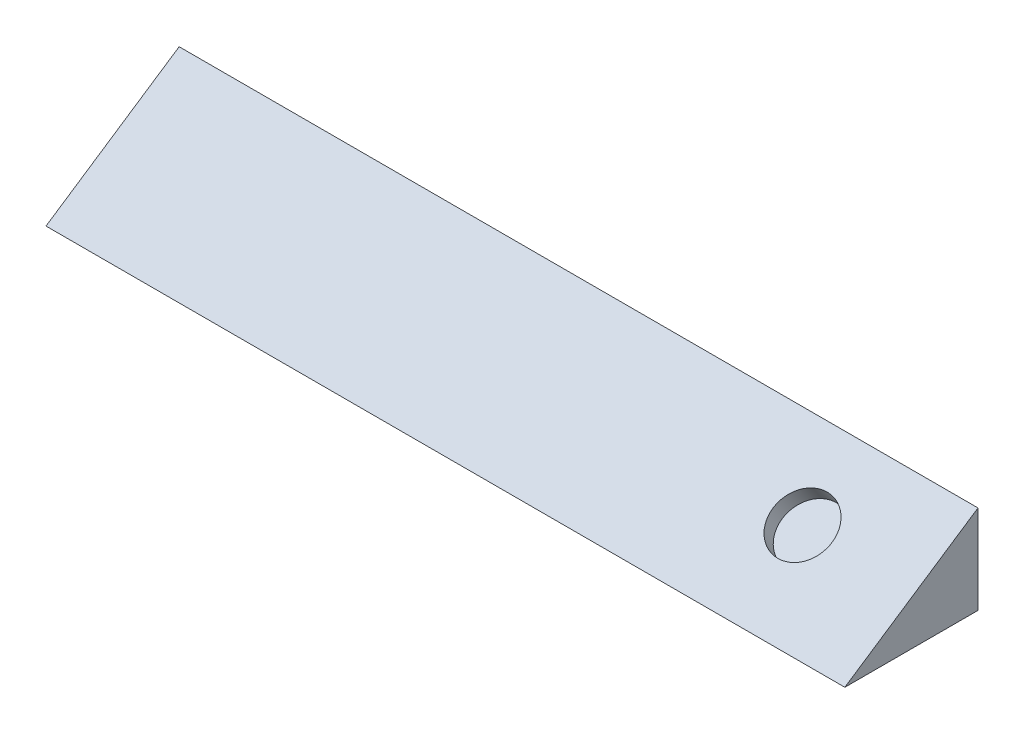
ISO-10303-21;
HEADER;
FILE_DESCRIPTION(('STEP AP214'),'2;1');
FILE_NAME('part.step','',(''),(''),'','','');
FILE_SCHEMA(('AUTOMOTIVE_DESIGN { 1 0 10303 214 1 1 1 1 }'));
ENDSEC;
DATA;
#1=APPLICATION_CONTEXT('core data for automotive mechanical design processes');
#2=APPLICATION_PROTOCOL_DEFINITION('international standard','automotive_design',2000,#1);
#3=PRODUCT_CONTEXT('',#1,'mechanical');
#4=PRODUCT('Part','Part','',(#3));
#5=PRODUCT_RELATED_PRODUCT_CATEGORY('part','',(#4));
#6=PRODUCT_DEFINITION_FORMATION('','',#4);
#7=PRODUCT_DEFINITION_CONTEXT('part definition',#1,'design');
#8=PRODUCT_DEFINITION('design','',#6,#7);
#9=PRODUCT_DEFINITION_SHAPE('','',#8);
#10=(LENGTH_UNIT() NAMED_UNIT(*) SI_UNIT(.MILLI.,.METRE.));
#11=(NAMED_UNIT(*) PLANE_ANGLE_UNIT() SI_UNIT($,.RADIAN.));
#12=(NAMED_UNIT(*) SI_UNIT($,.STERADIAN.) SOLID_ANGLE_UNIT());
#13=UNCERTAINTY_MEASURE_WITH_UNIT(LENGTH_MEASURE(1.E-05),#10,'distance_accuracy_value','');
#14=(GEOMETRIC_REPRESENTATION_CONTEXT(3) GLOBAL_UNCERTAINTY_ASSIGNED_CONTEXT((#13)) GLOBAL_UNIT_ASSIGNED_CONTEXT((#10,
#11,#12)) REPRESENTATION_CONTEXT('',''));
#15=CARTESIAN_POINT('',(0.,0.,0.));
#16=DIRECTION('',(0.,0.,1.));
#17=DIRECTION('',(1.,0.,0.));
#18=AXIS2_PLACEMENT_3D('',#15,#16,#17);
#19=CARTESIAN_POINT('',(914.4,83.1740717020161,20.4327125680614));
#20=DIRECTION('',(0.,-0.832050294337844,-0.554700196225229));
#21=DIRECTION('',(0.,0.554700196225229,-0.832050294337844));
#22=AXIS2_PLACEMENT_3D('',#19,#20,#21);
#23=PLANE('',#22);
#24=CARTESIAN_POINT('',(784.078611342463,36.1466775637232,90.9738037755007));
#25=DIRECTION('',(0.,0.832050294337843,0.554700196225229));
#26=DIRECTION('',(0.,-0.554700196225229,0.832050294337843));
#27=AXIS2_PLACEMENT_3D('',#24,#25,#26);
#28=CIRCLE('',#27,33.9022753872248);
#29=CARTESIAN_POINT('',(784.078611342463,17.3410787539478,119.182201990164));
#30=VERTEX_POINT('',#29);
#31=EDGE_CURVE('E91',#30,#30,#28,.T.);
#32=ORIENTED_EDGE('',*,*,#31,.F.);
#33=EDGE_LOOP('',(#32));
#34=FACE_BOUND('',#33,.T.);
#35=DIRECTION('',(0.,-0.554700196225229,0.832050294337844));
#36=VECTOR('',#35,1.);
#37=CARTESIAN_POINT('',(0.,83.1740717020161,20.4327125680614));
#38=LINE('',#37,#36);
#39=CARTESIAN_POINT('',(0.,83.1740717020161,20.4327125680614));
#40=VERTEX_POINT('',#39);
#41=CARTESIAN_POINT('',(0.,-18.4259282979839,172.832712568061));
#42=VERTEX_POINT('',#41);
#43=EDGE_CURVE('E84',#40,#42,#38,.T.);
#44=ORIENTED_EDGE('',*,*,#43,.T.);
#45=DIRECTION('',(-1.,0.,0.));
#46=VECTOR('',#45,1.);
#47=CARTESIAN_POINT('',(914.4,-18.4259282979839,172.832712568061));
#48=LINE('',#47,#46);
#49=CARTESIAN_POINT('',(914.4,-18.4259282979839,172.832712568061));
#50=VERTEX_POINT('',#49);
#51=EDGE_CURVE('E11',#50,#42,#48,.T.);
#52=ORIENTED_EDGE('',*,*,#51,.F.);
#53=DIRECTION('',(0.,-0.554700196225229,0.832050294337844));
#54=VECTOR('',#53,1.);
#55=CARTESIAN_POINT('',(914.4,83.1740717020161,20.4327125680614));
#56=LINE('',#55,#54);
#57=CARTESIAN_POINT('',(914.4,83.1740717020161,20.4327125680614));
#58=VERTEX_POINT('',#57);
#59=EDGE_CURVE('E77',#58,#50,#56,.T.);
#60=ORIENTED_EDGE('',*,*,#59,.F.);
#61=DIRECTION('',(-1.,0.,0.));
#62=VECTOR('',#61,1.);
#63=CARTESIAN_POINT('',(914.4,83.1740717020161,20.4327125680614));
#64=LINE('',#63,#62);
#65=EDGE_CURVE('E85',#58,#40,#64,.T.);
#66=ORIENTED_EDGE('',*,*,#65,.T.);
#67=EDGE_LOOP('',(#44,#52,#60,#66));
#68=FACE_BOUND('',#67,.T.);
#69=ADVANCED_FACE('F37',(#34,#68),#23,.F.);
#70=CARTESIAN_POINT('',(914.4,-18.4259282979839,172.832712568061));
#71=DIRECTION('',(0.,1.,0.));
#72=DIRECTION('',(0.,0.,1.));
#73=AXIS2_PLACEMENT_3D('',#70,#71,#72);
#74=PLANE('',#73);
#75=DIRECTION('',(0.,0.,-1.));
#76=VECTOR('',#75,1.);
#77=CARTESIAN_POINT('',(0.,-18.4259282979839,172.832712568061));
#78=LINE('',#77,#76);
#79=CARTESIAN_POINT('',(0.,-18.4259282979839,20.4327125680614));
#80=VERTEX_POINT('',#79);
#81=EDGE_CURVE('E65',#42,#80,#78,.T.);
#82=ORIENTED_EDGE('',*,*,#81,.T.);
#83=DIRECTION('',(-1.,0.,0.));
#84=VECTOR('',#83,1.);
#85=CARTESIAN_POINT('',(914.4,-18.4259282979839,20.4327125680614));
#86=LINE('',#85,#84);
#87=CARTESIAN_POINT('',(914.4,-18.4259282979839,20.4327125680614));
#88=VERTEX_POINT('',#87);
#89=EDGE_CURVE('E45',#88,#80,#86,.T.);
#90=ORIENTED_EDGE('',*,*,#89,.F.);
#91=DIRECTION('',(0.,0.,-1.));
#92=VECTOR('',#91,1.);
#93=CARTESIAN_POINT('',(914.4,-18.4259282979839,172.832712568061));
#94=LINE('',#93,#92);
#95=EDGE_CURVE('E73',#50,#88,#94,.T.);
#96=ORIENTED_EDGE('',*,*,#95,.F.);
#97=ORIENTED_EDGE('',*,*,#51,.T.);
#98=EDGE_LOOP('',(#82,#90,#96,#97));
#99=FACE_BOUND('',#98,.T.);
#100=ADVANCED_FACE('F74',(#99),#74,.F.);
#101=CARTESIAN_POINT('',(914.4,-18.4259282979839,20.4327125680614));
#102=DIRECTION('',(0.,0.,1.));
#103=DIRECTION('',(1.,0.,0.));
#104=AXIS2_PLACEMENT_3D('',#101,#102,#103);
#105=PLANE('',#104);
#106=DIRECTION('',(0.,1.,0.));
#107=VECTOR('',#106,1.);
#108=CARTESIAN_POINT('',(0.,-18.4259282979839,20.4327125680614));
#109=LINE('',#108,#107);
#110=EDGE_CURVE('E70',#80,#40,#109,.T.);
#111=ORIENTED_EDGE('',*,*,#110,.T.);
#112=ORIENTED_EDGE('',*,*,#65,.F.);
#113=DIRECTION('',(0.,1.,0.));
#114=VECTOR('',#113,1.);
#115=CARTESIAN_POINT('',(914.4,-18.4259282979839,20.4327125680614));
#116=LINE('',#115,#114);
#117=EDGE_CURVE('E53',#88,#58,#116,.T.);
#118=ORIENTED_EDGE('',*,*,#117,.F.);
#119=ORIENTED_EDGE('',*,*,#89,.T.);
#120=EDGE_LOOP('',(#111,#112,#118,#119));
#121=FACE_BOUND('',#120,.T.);
#122=ADVANCED_FACE('F96',(#121),#105,.F.);
#123=CARTESIAN_POINT('',(914.4,0.,0.));
#124=DIRECTION('',(-1.,0.,0.));
#125=DIRECTION('',(0.,0.,1.));
#126=AXIS2_PLACEMENT_3D('',#123,#124,#125);
#127=PLANE('',#126);
#128=ORIENTED_EDGE('',*,*,#59,.T.);
#129=ORIENTED_EDGE('',*,*,#95,.T.);
#130=ORIENTED_EDGE('',*,*,#117,.T.);
#131=EDGE_LOOP('',(#128,#129,#130));
#132=FACE_BOUND('',#131,.T.);
#133=ADVANCED_FACE('F80',(#132),#127,.F.);
#134=CARTESIAN_POINT('',(0.,0.,0.));
#135=DIRECTION('',(-1.,0.,0.));
#136=DIRECTION('',(0.,0.,1.));
#137=AXIS2_PLACEMENT_3D('',#134,#135,#136);
#138=PLANE('',#137);
#139=ORIENTED_EDGE('',*,*,#43,.F.);
#140=ORIENTED_EDGE('',*,*,#110,.F.);
#141=ORIENTED_EDGE('',*,*,#81,.F.);
#142=EDGE_LOOP('',(#139,#140,#141));
#143=FACE_BOUND('',#142,.T.);
#144=ADVANCED_FACE('F97',(#143),#138,.T.);
#145=CARTESIAN_POINT('',(784.078611342463,20.2961194565873,80.4067650374101));
#146=DIRECTION('',(0.,0.832050294337843,0.554700196225229));
#147=DIRECTION('',(0.,-0.554700196225229,0.832050294337844));
#148=AXIS2_PLACEMENT_3D('',#145,#146,#147);
#149=CYLINDRICAL_SURFACE('',#148,33.9022753872248);
#150=CARTESIAN_POINT('',(784.078611342463,20.2961194565873,80.4067650374101));
#151=DIRECTION('',(0.,0.832050294337843,0.554700196225229));
#152=DIRECTION('',(0.,-0.554700196225229,0.832050294337843));
#153=AXIS2_PLACEMENT_3D('',#150,#151,#152);
#154=CIRCLE('',#153,33.9022753872248);
#155=CARTESIAN_POINT('',(784.078611342463,1.49052064681192,108.615163252073));
#156=VERTEX_POINT('',#155);
#157=EDGE_CURVE('E87',#156,#156,#154,.T.);
#158=ORIENTED_EDGE('',*,*,#157,.F.);
#159=EDGE_LOOP('',(#158));
#160=FACE_BOUND('',#159,.T.);
#161=ORIENTED_EDGE('',*,*,#31,.T.);
#162=EDGE_LOOP('',(#161));
#163=FACE_BOUND('',#162,.T.);
#164=ADVANCED_FACE('F99',(#160,#163),#149,.F.);
#165=CARTESIAN_POINT('',(784.078611342463,20.2961194565873,80.4067650374101));
#166=DIRECTION('',(0.,0.832050294337843,0.554700196225229));
#167=DIRECTION('',(0.,-0.554700196225229,0.832050294337843));
#168=AXIS2_PLACEMENT_3D('',#165,#166,#167);
#169=PLANE('',#168);
#170=ORIENTED_EDGE('',*,*,#157,.T.);
#171=EDGE_LOOP('',(#170));
#172=FACE_BOUND('',#171,.T.);
#173=ADVANCED_FACE('F105',(#172),#169,.T.);
#174=CLOSED_SHELL('',(#69,#100,#122,#133,#144,#164,#173));
#175=MANIFOLD_SOLID_BREP('B2',#174);
#176=ADVANCED_BREP_SHAPE_REPRESENTATION('',(#18,#175),#14);
#177=SHAPE_DEFINITION_REPRESENTATION(#9,#176);
ENDSEC;
END-ISO-10303-21;
